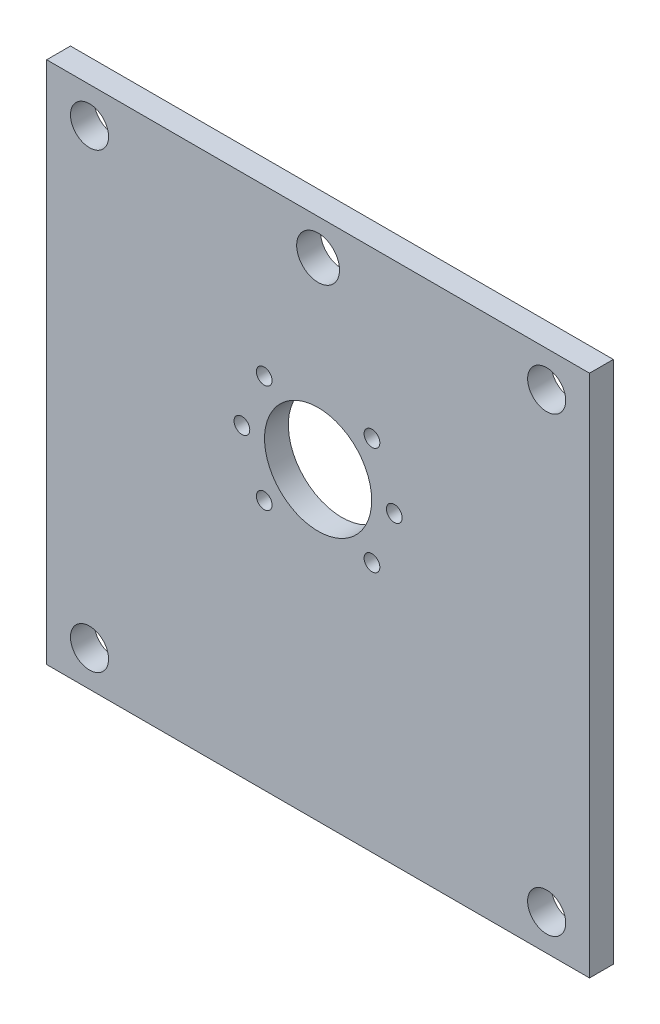
ISO-10303-21;
HEADER;
FILE_DESCRIPTION(('STEP AP214'),'2;1');
FILE_NAME('part.step','',(''),(''),'','','');
FILE_SCHEMA(('AUTOMOTIVE_DESIGN { 1 0 10303 214 1 1 1 1 }'));
ENDSEC;
DATA;
#1=APPLICATION_CONTEXT('core data for automotive mechanical design processes');
#2=APPLICATION_PROTOCOL_DEFINITION('international standard','automotive_design',2000,#1);
#3=PRODUCT_CONTEXT('',#1,'mechanical');
#4=PRODUCT('Part','Part','',(#3));
#5=PRODUCT_RELATED_PRODUCT_CATEGORY('part','',(#4));
#6=PRODUCT_DEFINITION_FORMATION('','',#4);
#7=PRODUCT_DEFINITION_CONTEXT('part definition',#1,'design');
#8=PRODUCT_DEFINITION('design','',#6,#7);
#9=PRODUCT_DEFINITION_SHAPE('','',#8);
#10=(LENGTH_UNIT() NAMED_UNIT(*) SI_UNIT(.MILLI.,.METRE.));
#11=(NAMED_UNIT(*) PLANE_ANGLE_UNIT() SI_UNIT($,.RADIAN.));
#12=(NAMED_UNIT(*) SI_UNIT($,.STERADIAN.) SOLID_ANGLE_UNIT());
#13=UNCERTAINTY_MEASURE_WITH_UNIT(LENGTH_MEASURE(1.E-05),#10,'distance_accuracy_value','');
#14=(GEOMETRIC_REPRESENTATION_CONTEXT(3) GLOBAL_UNCERTAINTY_ASSIGNED_CONTEXT((#13)) GLOBAL_UNIT_ASSIGNED_CONTEXT((#10,
#11,#12)) REPRESENTATION_CONTEXT('',''));
#15=CARTESIAN_POINT('',(0.,0.,0.));
#16=DIRECTION('',(0.,0.,1.));
#17=DIRECTION('',(1.,0.,0.));
#18=AXIS2_PLACEMENT_3D('',#15,#16,#17);
#19=CARTESIAN_POINT('',(0.,0.,5.));
#20=DIRECTION('',(0.,0.,1.));
#21=DIRECTION('',(1.,0.,0.));
#22=AXIS2_PLACEMENT_3D('',#19,#20,#21);
#23=PLANE('',#22);
#24=CARTESIAN_POINT('',(0.,47.5,5.));
#25=DIRECTION('',(0.,0.,1.));
#26=DIRECTION('',(1.,0.,0.));
#27=AXIS2_PLACEMENT_3D('',#24,#25,#26);
#28=CIRCLE('',#27,4.5);
#29=CARTESIAN_POINT('',(4.5,47.5,5.));
#30=VERTEX_POINT('',#29);
#31=EDGE_CURVE('E179',#30,#30,#28,.T.);
#32=ORIENTED_EDGE('',*,*,#31,.F.);
#33=EDGE_LOOP('',(#32));
#34=FACE_BOUND('',#33,.T.);
#35=CARTESIAN_POINT('',(11.3137084989847,20.3137084989779,5.));
#36=DIRECTION('',(0.,0.,1.));
#37=DIRECTION('',(1.,0.,0.));
#38=AXIS2_PLACEMENT_3D('',#35,#36,#37);
#39=CIRCLE('',#38,1.64999999999999);
#40=CARTESIAN_POINT('',(12.9637084989847,20.3137084989779,5.));
#41=VERTEX_POINT('',#40);
#42=EDGE_CURVE('E175',#41,#41,#39,.T.);
#43=ORIENTED_EDGE('',*,*,#42,.F.);
#44=EDGE_LOOP('',(#43));
#45=FACE_BOUND('',#44,.T.);
#46=CARTESIAN_POINT('',(16.,8.99999999999318,5.));
#47=DIRECTION('',(0.,0.,1.));
#48=DIRECTION('',(1.,0.,0.));
#49=AXIS2_PLACEMENT_3D('',#46,#47,#48);
#50=CIRCLE('',#49,1.64999999999999);
#51=CARTESIAN_POINT('',(17.65,8.99999999999318,5.));
#52=VERTEX_POINT('',#51);
#53=EDGE_CURVE('E169',#52,#52,#50,.T.);
#54=ORIENTED_EDGE('',*,*,#53,.F.);
#55=EDGE_LOOP('',(#54));
#56=FACE_BOUND('',#55,.T.);
#57=CARTESIAN_POINT('',(11.3137084989848,-2.31370849899164,5.));
#58=DIRECTION('',(0.,0.,1.));
#59=DIRECTION('',(1.,0.,0.));
#60=AXIS2_PLACEMENT_3D('',#57,#58,#59);
#61=CIRCLE('',#60,1.64999999999999);
#62=CARTESIAN_POINT('',(12.9637084989848,-2.31370849899164,5.));
#63=VERTEX_POINT('',#62);
#64=EDGE_CURVE('E163',#63,#63,#61,.T.);
#65=ORIENTED_EDGE('',*,*,#64,.F.);
#66=EDGE_LOOP('',(#65));
#67=FACE_BOUND('',#66,.T.);
#68=CARTESIAN_POINT('',(-11.3137084989849,20.3137084989777,5.));
#69=DIRECTION('',(0.,0.,1.));
#70=DIRECTION('',(1.,0.,0.));
#71=AXIS2_PLACEMENT_3D('',#68,#69,#70);
#72=CIRCLE('',#71,1.64999999999999);
#73=CARTESIAN_POINT('',(-9.66370849898492,20.3137084989777,5.));
#74=VERTEX_POINT('',#73);
#75=EDGE_CURVE('E157',#74,#74,#72,.T.);
#76=ORIENTED_EDGE('',*,*,#75,.F.);
#77=EDGE_LOOP('',(#76));
#78=FACE_BOUND('',#77,.T.);
#79=CARTESIAN_POINT('',(-11.3137084989848,-2.31370849899173,5.));
#80=DIRECTION('',(0.,0.,1.));
#81=DIRECTION('',(1.,0.,0.));
#82=AXIS2_PLACEMENT_3D('',#79,#80,#81);
#83=CIRCLE('',#82,1.64999999999999);
#84=CARTESIAN_POINT('',(-9.66370849898477,-2.31370849899173,5.));
#85=VERTEX_POINT('',#84);
#86=EDGE_CURVE('E151',#85,#85,#83,.T.);
#87=ORIENTED_EDGE('',*,*,#86,.F.);
#88=EDGE_LOOP('',(#87));
#89=FACE_BOUND('',#88,.T.);
#90=CARTESIAN_POINT('',(-16.,9.,5.));
#91=DIRECTION('',(0.,0.,1.));
#92=DIRECTION('',(1.,0.,0.));
#93=AXIS2_PLACEMENT_3D('',#90,#91,#92);
#94=CIRCLE('',#93,1.64999999999999);
#95=CARTESIAN_POINT('',(-14.35,9.,5.));
#96=VERTEX_POINT('',#95);
#97=EDGE_CURVE('E145',#96,#96,#94,.T.);
#98=ORIENTED_EDGE('',*,*,#97,.F.);
#99=EDGE_LOOP('',(#98));
#100=FACE_BOUND('',#99,.T.);
#101=CARTESIAN_POINT('',(-48.,-47.5,5.));
#102=DIRECTION('',(0.,0.,-1.));
#103=DIRECTION('',(1.,0.,0.));
#104=AXIS2_PLACEMENT_3D('',#101,#102,#103);
#105=CIRCLE('',#104,4.);
#106=CARTESIAN_POINT('',(-44.,-47.5,5.));
#107=VERTEX_POINT('',#106);
#108=EDGE_CURVE('E125',#107,#107,#105,.T.);
#109=ORIENTED_EDGE('',*,*,#108,.T.);
#110=EDGE_LOOP('',(#109));
#111=FACE_BOUND('',#110,.T.);
#112=CARTESIAN_POINT('',(-48.,47.5,5.));
#113=DIRECTION('',(0.,0.,1.));
#114=DIRECTION('',(1.,0.,0.));
#115=AXIS2_PLACEMENT_3D('',#112,#113,#114);
#116=CIRCLE('',#115,4.);
#117=CARTESIAN_POINT('',(-44.,47.5,5.));
#118=VERTEX_POINT('',#117);
#119=EDGE_CURVE('E119',#118,#118,#116,.T.);
#120=ORIENTED_EDGE('',*,*,#119,.F.);
#121=EDGE_LOOP('',(#120));
#122=FACE_BOUND('',#121,.T.);
#123=DIRECTION('',(0.,1.,0.));
#124=VECTOR('',#123,1.);
#125=CARTESIAN_POINT('',(57.,55.,5.));
#126=LINE('',#125,#124);
#127=CARTESIAN_POINT('',(57.,-55.,5.));
#128=VERTEX_POINT('',#127);
#129=CARTESIAN_POINT('',(57.,55.,5.));
#130=VERTEX_POINT('',#129);
#131=EDGE_CURVE('E86',#128,#130,#126,.T.);
#132=ORIENTED_EDGE('',*,*,#131,.T.);
#133=DIRECTION('',(-1.,0.,0.));
#134=VECTOR('',#133,1.);
#135=CARTESIAN_POINT('',(-57.,55.,5.));
#136=LINE('',#135,#134);
#137=CARTESIAN_POINT('',(-57.,55.,5.));
#138=VERTEX_POINT('',#137);
#139=EDGE_CURVE('E81',#130,#138,#136,.T.);
#140=ORIENTED_EDGE('',*,*,#139,.T.);
#141=DIRECTION('',(0.,-1.,0.));
#142=VECTOR('',#141,1.);
#143=CARTESIAN_POINT('',(-57.,55.,5.));
#144=LINE('',#143,#142);
#145=CARTESIAN_POINT('',(-57.,-55.,5.));
#146=VERTEX_POINT('',#145);
#147=EDGE_CURVE('E84',#138,#146,#144,.T.);
#148=ORIENTED_EDGE('',*,*,#147,.T.);
#149=DIRECTION('',(1.,0.,0.));
#150=VECTOR('',#149,1.);
#151=CARTESIAN_POINT('',(-57.,-55.,5.));
#152=LINE('',#151,#150);
#153=EDGE_CURVE('E51',#146,#128,#152,.T.);
#154=ORIENTED_EDGE('',*,*,#153,.T.);
#155=EDGE_LOOP('',(#132,#140,#148,#154));
#156=FACE_BOUND('',#155,.T.);
#157=CARTESIAN_POINT('',(0.,9.,5.));
#158=DIRECTION('',(0.,0.,1.));
#159=DIRECTION('',(1.,0.,0.));
#160=AXIS2_PLACEMENT_3D('',#157,#158,#159);
#161=CIRCLE('',#160,11.25);
#162=CARTESIAN_POINT('',(11.25,9.,5.));
#163=VERTEX_POINT('',#162);
#164=EDGE_CURVE('E101',#163,#163,#161,.T.);
#165=ORIENTED_EDGE('',*,*,#164,.F.);
#166=EDGE_LOOP('',(#165));
#167=FACE_BOUND('',#166,.T.);
#168=CARTESIAN_POINT('',(48.,-47.5,5.));
#169=DIRECTION('',(0.,0.,1.));
#170=DIRECTION('',(-1.,0.,0.));
#171=AXIS2_PLACEMENT_3D('',#168,#169,#170);
#172=CIRCLE('',#171,4.);
#173=CARTESIAN_POINT('',(44.,-47.5,5.));
#174=VERTEX_POINT('',#173);
#175=EDGE_CURVE('E131',#174,#174,#172,.T.);
#176=ORIENTED_EDGE('',*,*,#175,.F.);
#177=EDGE_LOOP('',(#176));
#178=FACE_BOUND('',#177,.T.);
#179=CARTESIAN_POINT('',(48.,47.5,5.));
#180=DIRECTION('',(0.,0.,-1.));
#181=DIRECTION('',(-1.,0.,0.));
#182=AXIS2_PLACEMENT_3D('',#179,#180,#181);
#183=CIRCLE('',#182,4.);
#184=CARTESIAN_POINT('',(44.,47.5,5.));
#185=VERTEX_POINT('',#184);
#186=EDGE_CURVE('E137',#185,#185,#183,.T.);
#187=ORIENTED_EDGE('',*,*,#186,.T.);
#188=EDGE_LOOP('',(#187));
#189=FACE_BOUND('',#188,.T.);
#190=ADVANCED_FACE('F34',(#34,#45,#56,#67,#78,#89,#100,#111,#122,#156,#167,#178,#189),#23,.T.);
#191=CARTESIAN_POINT('',(0.,0.,0.));
#192=DIRECTION('',(0.,0.,1.));
#193=DIRECTION('',(1.,0.,0.));
#194=AXIS2_PLACEMENT_3D('',#191,#192,#193);
#195=PLANE('',#194);
#196=CARTESIAN_POINT('',(0.,47.5,0.));
#197=DIRECTION('',(0.,0.,1.));
#198=DIRECTION('',(1.,0.,0.));
#199=AXIS2_PLACEMENT_3D('',#196,#197,#198);
#200=CIRCLE('',#199,4.5);
#201=CARTESIAN_POINT('',(4.5,47.5,0.));
#202=VERTEX_POINT('',#201);
#203=EDGE_CURVE('E178',#202,#202,#200,.T.);
#204=ORIENTED_EDGE('',*,*,#203,.T.);
#205=EDGE_LOOP('',(#204));
#206=FACE_BOUND('',#205,.T.);
#207=CARTESIAN_POINT('',(11.3137084989847,20.3137084989779,0.));
#208=DIRECTION('',(0.,0.,1.));
#209=DIRECTION('',(1.,0.,0.));
#210=AXIS2_PLACEMENT_3D('',#207,#208,#209);
#211=CIRCLE('',#210,1.65);
#212=CARTESIAN_POINT('',(12.9637084989847,20.3137084989779,0.));
#213=VERTEX_POINT('',#212);
#214=EDGE_CURVE('E172',#213,#213,#211,.T.);
#215=ORIENTED_EDGE('',*,*,#214,.T.);
#216=EDGE_LOOP('',(#215));
#217=FACE_BOUND('',#216,.T.);
#218=CARTESIAN_POINT('',(16.,8.99999999999318,0.));
#219=DIRECTION('',(0.,0.,1.));
#220=DIRECTION('',(1.,0.,0.));
#221=AXIS2_PLACEMENT_3D('',#218,#219,#220);
#222=CIRCLE('',#221,1.65);
#223=CARTESIAN_POINT('',(17.65,8.99999999999318,0.));
#224=VERTEX_POINT('',#223);
#225=EDGE_CURVE('E166',#224,#224,#222,.T.);
#226=ORIENTED_EDGE('',*,*,#225,.T.);
#227=EDGE_LOOP('',(#226));
#228=FACE_BOUND('',#227,.T.);
#229=CARTESIAN_POINT('',(11.3137084989848,-2.31370849899164,0.));
#230=DIRECTION('',(0.,0.,1.));
#231=DIRECTION('',(1.,0.,0.));
#232=AXIS2_PLACEMENT_3D('',#229,#230,#231);
#233=CIRCLE('',#232,1.65);
#234=CARTESIAN_POINT('',(12.9637084989848,-2.31370849899164,0.));
#235=VERTEX_POINT('',#234);
#236=EDGE_CURVE('E160',#235,#235,#233,.T.);
#237=ORIENTED_EDGE('',*,*,#236,.T.);
#238=EDGE_LOOP('',(#237));
#239=FACE_BOUND('',#238,.T.);
#240=CARTESIAN_POINT('',(-11.3137084989849,20.3137084989777,0.));
#241=DIRECTION('',(0.,0.,1.));
#242=DIRECTION('',(1.,0.,0.));
#243=AXIS2_PLACEMENT_3D('',#240,#241,#242);
#244=CIRCLE('',#243,1.65);
#245=CARTESIAN_POINT('',(-9.66370849898491,20.3137084989777,0.));
#246=VERTEX_POINT('',#245);
#247=EDGE_CURVE('E154',#246,#246,#244,.T.);
#248=ORIENTED_EDGE('',*,*,#247,.T.);
#249=EDGE_LOOP('',(#248));
#250=FACE_BOUND('',#249,.T.);
#251=CARTESIAN_POINT('',(-11.3137084989848,-2.31370849899173,0.));
#252=DIRECTION('',(0.,0.,1.));
#253=DIRECTION('',(1.,0.,0.));
#254=AXIS2_PLACEMENT_3D('',#251,#252,#253);
#255=CIRCLE('',#254,1.65);
#256=CARTESIAN_POINT('',(-9.66370849898476,-2.31370849899173,0.));
#257=VERTEX_POINT('',#256);
#258=EDGE_CURVE('E148',#257,#257,#255,.T.);
#259=ORIENTED_EDGE('',*,*,#258,.T.);
#260=EDGE_LOOP('',(#259));
#261=FACE_BOUND('',#260,.T.);
#262=CARTESIAN_POINT('',(-16.,9.,0.));
#263=DIRECTION('',(0.,0.,1.));
#264=DIRECTION('',(1.,0.,0.));
#265=AXIS2_PLACEMENT_3D('',#262,#263,#264);
#266=CIRCLE('',#265,1.65);
#267=CARTESIAN_POINT('',(-14.35,9.,0.));
#268=VERTEX_POINT('',#267);
#269=EDGE_CURVE('E140',#268,#268,#266,.T.);
#270=ORIENTED_EDGE('',*,*,#269,.T.);
#271=EDGE_LOOP('',(#270));
#272=FACE_BOUND('',#271,.T.);
#273=CARTESIAN_POINT('',(-48.,-47.5,0.));
#274=DIRECTION('',(0.,0.,-1.));
#275=DIRECTION('',(1.,0.,0.));
#276=AXIS2_PLACEMENT_3D('',#273,#274,#275);
#277=CIRCLE('',#276,4.);
#278=CARTESIAN_POINT('',(-44.,-47.5,0.));
#279=VERTEX_POINT('',#278);
#280=EDGE_CURVE('E122',#279,#279,#277,.T.);
#281=ORIENTED_EDGE('',*,*,#280,.F.);
#282=EDGE_LOOP('',(#281));
#283=FACE_BOUND('',#282,.T.);
#284=CARTESIAN_POINT('',(-48.,47.5,0.));
#285=DIRECTION('',(0.,0.,1.));
#286=DIRECTION('',(1.,0.,0.));
#287=AXIS2_PLACEMENT_3D('',#284,#285,#286);
#288=CIRCLE('',#287,4.);
#289=CARTESIAN_POINT('',(-44.,47.5,0.));
#290=VERTEX_POINT('',#289);
#291=EDGE_CURVE('E116',#290,#290,#288,.T.);
#292=ORIENTED_EDGE('',*,*,#291,.T.);
#293=EDGE_LOOP('',(#292));
#294=FACE_BOUND('',#293,.T.);
#295=DIRECTION('',(0.,1.,0.));
#296=VECTOR('',#295,1.);
#297=CARTESIAN_POINT('',(57.,55.,0.));
#298=LINE('',#297,#296);
#299=CARTESIAN_POINT('',(57.,-55.,0.));
#300=VERTEX_POINT('',#299);
#301=CARTESIAN_POINT('',(57.,55.,0.));
#302=VERTEX_POINT('',#301);
#303=EDGE_CURVE('E98',#300,#302,#298,.T.);
#304=ORIENTED_EDGE('',*,*,#303,.F.);
#305=DIRECTION('',(1.,0.,0.));
#306=VECTOR('',#305,1.);
#307=CARTESIAN_POINT('',(-57.,-55.,0.));
#308=LINE('',#307,#306);
#309=CARTESIAN_POINT('',(-57.,-55.,0.));
#310=VERTEX_POINT('',#309);
#311=EDGE_CURVE('E74',#310,#300,#308,.T.);
#312=ORIENTED_EDGE('',*,*,#311,.F.);
#313=DIRECTION('',(0.,-1.,0.));
#314=VECTOR('',#313,1.);
#315=CARTESIAN_POINT('',(-57.,55.,0.));
#316=LINE('',#315,#314);
#317=CARTESIAN_POINT('',(-57.,55.,0.));
#318=VERTEX_POINT('',#317);
#319=EDGE_CURVE('E68',#318,#310,#316,.T.);
#320=ORIENTED_EDGE('',*,*,#319,.F.);
#321=DIRECTION('',(-1.,0.,0.));
#322=VECTOR('',#321,1.);
#323=CARTESIAN_POINT('',(-57.,55.,0.));
#324=LINE('',#323,#322);
#325=EDGE_CURVE('E90',#302,#318,#324,.T.);
#326=ORIENTED_EDGE('',*,*,#325,.F.);
#327=EDGE_LOOP('',(#304,#312,#320,#326));
#328=FACE_BOUND('',#327,.T.);
#329=CARTESIAN_POINT('',(0.,9.,0.));
#330=DIRECTION('',(0.,0.,1.));
#331=DIRECTION('',(1.,0.,0.));
#332=AXIS2_PLACEMENT_3D('',#329,#330,#331);
#333=CIRCLE('',#332,11.25);
#334=CARTESIAN_POINT('',(11.25,9.,0.));
#335=VERTEX_POINT('',#334);
#336=EDGE_CURVE('E113',#335,#335,#333,.T.);
#337=ORIENTED_EDGE('',*,*,#336,.T.);
#338=EDGE_LOOP('',(#337));
#339=FACE_BOUND('',#338,.T.);
#340=CARTESIAN_POINT('',(48.,-47.5,0.));
#341=DIRECTION('',(0.,0.,1.));
#342=DIRECTION('',(-1.,0.,0.));
#343=AXIS2_PLACEMENT_3D('',#340,#341,#342);
#344=CIRCLE('',#343,4.);
#345=CARTESIAN_POINT('',(44.,-47.5,0.));
#346=VERTEX_POINT('',#345);
#347=EDGE_CURVE('E128',#346,#346,#344,.T.);
#348=ORIENTED_EDGE('',*,*,#347,.T.);
#349=EDGE_LOOP('',(#348));
#350=FACE_BOUND('',#349,.T.);
#351=CARTESIAN_POINT('',(48.,47.5,0.));
#352=DIRECTION('',(0.,0.,-1.));
#353=DIRECTION('',(-1.,0.,0.));
#354=AXIS2_PLACEMENT_3D('',#351,#352,#353);
#355=CIRCLE('',#354,4.);
#356=CARTESIAN_POINT('',(44.,47.5,0.));
#357=VERTEX_POINT('',#356);
#358=EDGE_CURVE('E134',#357,#357,#355,.T.);
#359=ORIENTED_EDGE('',*,*,#358,.F.);
#360=EDGE_LOOP('',(#359));
#361=FACE_BOUND('',#360,.T.);
#362=ADVANCED_FACE('F109',(#206,#217,#228,#239,#250,#261,#272,#283,#294,#328,#339,#350,#361),
#195,.F.);
#363=CARTESIAN_POINT('',(57.,55.,5.));
#364=DIRECTION('',(-1.,0.,0.));
#365=DIRECTION('',(0.,-1.,0.));
#366=AXIS2_PLACEMENT_3D('',#363,#364,#365);
#367=PLANE('',#366);
#368=ORIENTED_EDGE('',*,*,#303,.T.);
#369=DIRECTION('',(0.,0.,-1.));
#370=VECTOR('',#369,1.);
#371=CARTESIAN_POINT('',(57.,55.,5.));
#372=LINE('',#371,#370);
#373=EDGE_CURVE('E11',#130,#302,#372,.T.);
#374=ORIENTED_EDGE('',*,*,#373,.F.);
#375=ORIENTED_EDGE('',*,*,#131,.F.);
#376=DIRECTION('',(0.,0.,-1.));
#377=VECTOR('',#376,1.);
#378=CARTESIAN_POINT('',(57.,-55.,5.));
#379=LINE('',#378,#377);
#380=EDGE_CURVE('E94',#128,#300,#379,.T.);
#381=ORIENTED_EDGE('',*,*,#380,.T.);
#382=EDGE_LOOP('',(#368,#374,#375,#381));
#383=FACE_BOUND('',#382,.T.);
#384=ADVANCED_FACE('F36',(#383),#367,.F.);
#385=CARTESIAN_POINT('',(-57.,55.,5.));
#386=DIRECTION('',(0.,-1.,0.));
#387=DIRECTION('',(0.,0.,-1.));
#388=AXIS2_PLACEMENT_3D('',#385,#386,#387);
#389=PLANE('',#388);
#390=ORIENTED_EDGE('',*,*,#325,.T.);
#391=DIRECTION('',(0.,0.,-1.));
#392=VECTOR('',#391,1.);
#393=CARTESIAN_POINT('',(-57.,55.,5.));
#394=LINE('',#393,#392);
#395=EDGE_CURVE('E43',#138,#318,#394,.T.);
#396=ORIENTED_EDGE('',*,*,#395,.F.);
#397=ORIENTED_EDGE('',*,*,#139,.F.);
#398=ORIENTED_EDGE('',*,*,#373,.T.);
#399=EDGE_LOOP('',(#390,#396,#397,#398));
#400=FACE_BOUND('',#399,.T.);
#401=ADVANCED_FACE('F89',(#400),#389,.F.);
#402=CARTESIAN_POINT('',(-57.,55.,5.));
#403=DIRECTION('',(1.,0.,0.));
#404=DIRECTION('',(0.,1.,0.));
#405=AXIS2_PLACEMENT_3D('',#402,#403,#404);
#406=PLANE('',#405);
#407=ORIENTED_EDGE('',*,*,#319,.T.);
#408=DIRECTION('',(0.,0.,-1.));
#409=VECTOR('',#408,1.);
#410=CARTESIAN_POINT('',(-57.,-55.,5.));
#411=LINE('',#410,#409);
#412=EDGE_CURVE('E91',#146,#310,#411,.T.);
#413=ORIENTED_EDGE('',*,*,#412,.F.);
#414=ORIENTED_EDGE('',*,*,#147,.F.);
#415=ORIENTED_EDGE('',*,*,#395,.T.);
#416=EDGE_LOOP('',(#407,#413,#414,#415));
#417=FACE_BOUND('',#416,.T.);
#418=ADVANCED_FACE('F92',(#417),#406,.F.);
#419=CARTESIAN_POINT('',(-57.,-55.,5.));
#420=DIRECTION('',(0.,1.,0.));
#421=DIRECTION('',(0.,0.,1.));
#422=AXIS2_PLACEMENT_3D('',#419,#420,#421);
#423=PLANE('',#422);
#424=ORIENTED_EDGE('',*,*,#311,.T.);
#425=ORIENTED_EDGE('',*,*,#380,.F.);
#426=ORIENTED_EDGE('',*,*,#153,.F.);
#427=ORIENTED_EDGE('',*,*,#412,.T.);
#428=EDGE_LOOP('',(#424,#425,#426,#427));
#429=FACE_BOUND('',#428,.T.);
#430=ADVANCED_FACE('F106',(#429),#423,.F.);
#431=CARTESIAN_POINT('',(0.,9.,5.));
#432=DIRECTION('',(0.,0.,-1.));
#433=DIRECTION('',(-1.,0.,0.));
#434=AXIS2_PLACEMENT_3D('',#431,#432,#433);
#435=CYLINDRICAL_SURFACE('',#434,11.25);
#436=ORIENTED_EDGE('',*,*,#164,.T.);
#437=EDGE_LOOP('',(#436));
#438=FACE_BOUND('',#437,.T.);
#439=ORIENTED_EDGE('',*,*,#336,.F.);
#440=EDGE_LOOP('',(#439));
#441=FACE_BOUND('',#440,.T.);
#442=ADVANCED_FACE('F216',(#438,#441),#435,.F.);
#443=CARTESIAN_POINT('',(-48.,47.5,0.));
#444=DIRECTION('',(0.,0.,1.));
#445=DIRECTION('',(1.,0.,0.));
#446=AXIS2_PLACEMENT_3D('',#443,#444,#445);
#447=CYLINDRICAL_SURFACE('',#446,4.);
#448=ORIENTED_EDGE('',*,*,#291,.F.);
#449=EDGE_LOOP('',(#448));
#450=FACE_BOUND('',#449,.T.);
#451=ORIENTED_EDGE('',*,*,#119,.T.);
#452=EDGE_LOOP('',(#451));
#453=FACE_BOUND('',#452,.T.);
#454=ADVANCED_FACE('F213',(#450,#453),#447,.F.);
#455=CARTESIAN_POINT('',(-48.,-47.5,0.));
#456=DIRECTION('',(0.,0.,1.));
#457=DIRECTION('',(1.,0.,0.));
#458=AXIS2_PLACEMENT_3D('',#455,#456,#457);
#459=CYLINDRICAL_SURFACE('',#458,4.);
#460=ORIENTED_EDGE('',*,*,#280,.T.);
#461=EDGE_LOOP('',(#460));
#462=FACE_BOUND('',#461,.T.);
#463=ORIENTED_EDGE('',*,*,#108,.F.);
#464=EDGE_LOOP('',(#463));
#465=FACE_BOUND('',#464,.T.);
#466=ADVANCED_FACE('F215',(#462,#465),#459,.F.);
#467=CARTESIAN_POINT('',(48.,-47.5,0.));
#468=DIRECTION('',(0.,0.,1.));
#469=DIRECTION('',(1.,0.,0.));
#470=AXIS2_PLACEMENT_3D('',#467,#468,#469);
#471=CYLINDRICAL_SURFACE('',#470,4.);
#472=ORIENTED_EDGE('',*,*,#347,.F.);
#473=EDGE_LOOP('',(#472));
#474=FACE_BOUND('',#473,.T.);
#475=ORIENTED_EDGE('',*,*,#175,.T.);
#476=EDGE_LOOP('',(#475));
#477=FACE_BOUND('',#476,.T.);
#478=ADVANCED_FACE('F223',(#474,#477),#471,.F.);
#479=CARTESIAN_POINT('',(48.,47.5,0.));
#480=DIRECTION('',(0.,0.,1.));
#481=DIRECTION('',(1.,0.,0.));
#482=AXIS2_PLACEMENT_3D('',#479,#480,#481);
#483=CYLINDRICAL_SURFACE('',#482,4.);
#484=ORIENTED_EDGE('',*,*,#358,.T.);
#485=EDGE_LOOP('',(#484));
#486=FACE_BOUND('',#485,.T.);
#487=ORIENTED_EDGE('',*,*,#186,.F.);
#488=EDGE_LOOP('',(#487));
#489=FACE_BOUND('',#488,.T.);
#490=ADVANCED_FACE('F312',(#486,#489),#483,.F.);
#491=CARTESIAN_POINT('',(-16.,9.,5.));
#492=DIRECTION('',(0.,0.,1.));
#493=DIRECTION('',(1.,0.,0.));
#494=AXIS2_PLACEMENT_3D('',#491,#492,#493);
#495=CYLINDRICAL_SURFACE('',#494,1.64999999999999);
#496=ORIENTED_EDGE('',*,*,#269,.F.);
#497=EDGE_LOOP('',(#496));
#498=FACE_BOUND('',#497,.T.);
#499=ORIENTED_EDGE('',*,*,#97,.T.);
#500=EDGE_LOOP('',(#499));
#501=FACE_BOUND('',#500,.T.);
#502=ADVANCED_FACE('F302',(#498,#501),#495,.F.);
#503=CARTESIAN_POINT('',(-11.3137084989848,-2.31370849899173,5.));
#504=DIRECTION('',(0.,0.,1.));
#505=DIRECTION('',(1.,0.,0.));
#506=AXIS2_PLACEMENT_3D('',#503,#504,#505);
#507=CYLINDRICAL_SURFACE('',#506,1.64999999999999);
#508=ORIENTED_EDGE('',*,*,#258,.F.);
#509=EDGE_LOOP('',(#508));
#510=FACE_BOUND('',#509,.T.);
#511=ORIENTED_EDGE('',*,*,#86,.T.);
#512=EDGE_LOOP('',(#511));
#513=FACE_BOUND('',#512,.T.);
#514=ADVANCED_FACE('F292',(#510,#513),#507,.F.);
#515=CARTESIAN_POINT('',(-11.3137084989849,20.3137084989777,5.));
#516=DIRECTION('',(0.,0.,1.));
#517=DIRECTION('',(1.,0.,0.));
#518=AXIS2_PLACEMENT_3D('',#515,#516,#517);
#519=CYLINDRICAL_SURFACE('',#518,1.64999999999999);
#520=ORIENTED_EDGE('',*,*,#247,.F.);
#521=EDGE_LOOP('',(#520));
#522=FACE_BOUND('',#521,.T.);
#523=ORIENTED_EDGE('',*,*,#75,.T.);
#524=EDGE_LOOP('',(#523));
#525=FACE_BOUND('',#524,.T.);
#526=ADVANCED_FACE('F282',(#522,#525),#519,.F.);
#527=CARTESIAN_POINT('',(11.3137084989848,-2.31370849899164,5.));
#528=DIRECTION('',(0.,0.,1.));
#529=DIRECTION('',(1.,0.,0.));
#530=AXIS2_PLACEMENT_3D('',#527,#528,#529);
#531=CYLINDRICAL_SURFACE('',#530,1.64999999999999);
#532=ORIENTED_EDGE('',*,*,#236,.F.);
#533=EDGE_LOOP('',(#532));
#534=FACE_BOUND('',#533,.T.);
#535=ORIENTED_EDGE('',*,*,#64,.T.);
#536=EDGE_LOOP('',(#535));
#537=FACE_BOUND('',#536,.T.);
#538=ADVANCED_FACE('F272',(#534,#537),#531,.F.);
#539=CARTESIAN_POINT('',(16.,8.99999999999318,5.));
#540=DIRECTION('',(0.,0.,1.));
#541=DIRECTION('',(1.,0.,0.));
#542=AXIS2_PLACEMENT_3D('',#539,#540,#541);
#543=CYLINDRICAL_SURFACE('',#542,1.64999999999999);
#544=ORIENTED_EDGE('',*,*,#225,.F.);
#545=EDGE_LOOP('',(#544));
#546=FACE_BOUND('',#545,.T.);
#547=ORIENTED_EDGE('',*,*,#53,.T.);
#548=EDGE_LOOP('',(#547));
#549=FACE_BOUND('',#548,.T.);
#550=ADVANCED_FACE('F261',(#546,#549),#543,.F.);
#551=CARTESIAN_POINT('',(11.3137084989847,20.3137084989779,5.));
#552=DIRECTION('',(0.,0.,1.));
#553=DIRECTION('',(1.,0.,0.));
#554=AXIS2_PLACEMENT_3D('',#551,#552,#553);
#555=CYLINDRICAL_SURFACE('',#554,1.64999999999999);
#556=ORIENTED_EDGE('',*,*,#214,.F.);
#557=EDGE_LOOP('',(#556));
#558=FACE_BOUND('',#557,.T.);
#559=ORIENTED_EDGE('',*,*,#42,.T.);
#560=EDGE_LOOP('',(#559));
#561=FACE_BOUND('',#560,.T.);
#562=ADVANCED_FACE('F190',(#558,#561),#555,.F.);
#563=CARTESIAN_POINT('',(0.,47.5,0.));
#564=DIRECTION('',(0.,0.,1.));
#565=DIRECTION('',(1.,0.,0.));
#566=AXIS2_PLACEMENT_3D('',#563,#564,#565);
#567=CYLINDRICAL_SURFACE('',#566,4.5);
#568=ORIENTED_EDGE('',*,*,#203,.F.);
#569=EDGE_LOOP('',(#568));
#570=FACE_BOUND('',#569,.T.);
#571=ORIENTED_EDGE('',*,*,#31,.T.);
#572=EDGE_LOOP('',(#571));
#573=FACE_BOUND('',#572,.T.);
#574=ADVANCED_FACE('F187',(#570,#573),#567,.F.);
#575=CLOSED_SHELL('',(#190,#362,#384,#401,#418,#430,#442,#454,#466,#478,#490,#502,#514,#526,
#538,#550,#562,#574));
#576=MANIFOLD_SOLID_BREP('B2',#575);
#577=ADVANCED_BREP_SHAPE_REPRESENTATION('',(#18,#576),#14);
#578=SHAPE_DEFINITION_REPRESENTATION(#9,#577);
ENDSEC;
END-ISO-10303-21;
